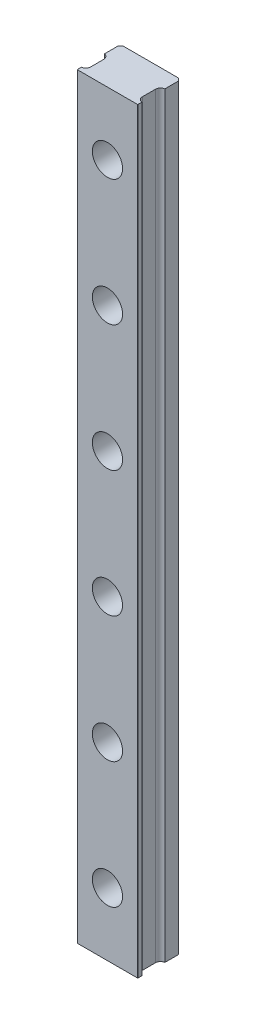
ISO-10303-21;
HEADER;
FILE_DESCRIPTION(('STEP AP214'),'2;1');
FILE_NAME('part.step','',(''),(''),'','','');
FILE_SCHEMA(('AUTOMOTIVE_DESIGN { 1 0 10303 214 1 1 1 1 }'));
ENDSEC;
DATA;
#1=APPLICATION_CONTEXT('core data for automotive mechanical design processes');
#2=APPLICATION_PROTOCOL_DEFINITION('international standard','automotive_design',2000,#1);
#3=PRODUCT_CONTEXT('',#1,'mechanical');
#4=PRODUCT('Part','Part','',(#3));
#5=PRODUCT_RELATED_PRODUCT_CATEGORY('part','',(#4));
#6=PRODUCT_DEFINITION_FORMATION('','',#4);
#7=PRODUCT_DEFINITION_CONTEXT('part definition',#1,'design');
#8=PRODUCT_DEFINITION('design','',#6,#7);
#9=PRODUCT_DEFINITION_SHAPE('','',#8);
#10=(LENGTH_UNIT() NAMED_UNIT(*) SI_UNIT(.MILLI.,.METRE.));
#11=(NAMED_UNIT(*) PLANE_ANGLE_UNIT() SI_UNIT($,.RADIAN.));
#12=(NAMED_UNIT(*) SI_UNIT($,.STERADIAN.) SOLID_ANGLE_UNIT());
#13=UNCERTAINTY_MEASURE_WITH_UNIT(LENGTH_MEASURE(1.E-05),#10,'distance_accuracy_value','');
#14=(GEOMETRIC_REPRESENTATION_CONTEXT(3) GLOBAL_UNCERTAINTY_ASSIGNED_CONTEXT((#13)) GLOBAL_UNIT_ASSIGNED_CONTEXT((#10,
#11,#12)) REPRESENTATION_CONTEXT('',''));
#15=CARTESIAN_POINT('',(0.,0.,0.));
#16=DIRECTION('',(0.,0.,1.));
#17=DIRECTION('',(1.,0.,0.));
#18=AXIS2_PLACEMENT_3D('',#15,#16,#17);
#19=CARTESIAN_POINT('',(6.,150.,8.59999999999999));
#20=DIRECTION('',(1.,0.,0.));
#21=DIRECTION('',(0.,0.,-1.));
#22=AXIS2_PLACEMENT_3D('',#19,#20,#21);
#23=PLANE('',#22);
#24=DIRECTION('',(0.,0.,-1.));
#25=VECTOR('',#24,1.);
#26=CARTESIAN_POINT('',(6.,0.,8.6));
#27=LINE('',#26,#25);
#28=CARTESIAN_POINT('',(6.,0.,3.20784326));
#29=VERTEX_POINT('',#28);
#30=CARTESIAN_POINT('',(6.,0.,0.500000000000028));
#31=VERTEX_POINT('',#30);
#32=EDGE_CURVE('E186',#29,#31,#27,.T.);
#33=ORIENTED_EDGE('',*,*,#32,.T.);
#34=DIRECTION('',(0.,1.,0.));
#35=VECTOR('',#34,1.);
#36=CARTESIAN_POINT('',(6.,150.,0.50000000000002));
#37=LINE('',#36,#35);
#38=CARTESIAN_POINT('',(6.,150.,0.50000000000002));
#39=VERTEX_POINT('',#38);
#40=EDGE_CURVE('E11',#31,#39,#37,.T.);
#41=ORIENTED_EDGE('',*,*,#40,.T.);
#42=DIRECTION('',(0.,0.,-1.));
#43=VECTOR('',#42,1.);
#44=CARTESIAN_POINT('',(6.,150.,8.59999999999999));
#45=LINE('',#44,#43);
#46=CARTESIAN_POINT('',(6.,150.,3.20784325999999));
#47=VERTEX_POINT('',#46);
#48=EDGE_CURVE('E163',#47,#39,#45,.T.);
#49=ORIENTED_EDGE('',*,*,#48,.F.);
#50=DIRECTION('',(0.,-1.,0.));
#51=VECTOR('',#50,1.);
#52=CARTESIAN_POINT('',(6.,150.,3.20784325999999));
#53=LINE('',#52,#51);
#54=EDGE_CURVE('E147',#47,#29,#53,.T.);
#55=ORIENTED_EDGE('',*,*,#54,.T.);
#56=EDGE_LOOP('',(#33,#41,#49,#55));
#57=FACE_BOUND('',#56,.T.);
#58=ADVANCED_FACE('F32',(#57),#23,.T.);
#59=CARTESIAN_POINT('',(-6.,0.,8.6));
#60=DIRECTION('',(-1.,0.,0.));
#61=DIRECTION('',(0.,0.,1.));
#62=AXIS2_PLACEMENT_3D('',#59,#60,#61);
#63=PLANE('',#62);
#64=DIRECTION('',(0.,0.,-1.));
#65=VECTOR('',#64,1.);
#66=CARTESIAN_POINT('',(-6.,0.,8.6));
#67=LINE('',#66,#65);
#68=CARTESIAN_POINT('',(-6.,0.,8.55000000000001));
#69=VERTEX_POINT('',#68);
#70=CARTESIAN_POINT('',(-6.,0.,7.79215674));
#71=VERTEX_POINT('',#70);
#72=EDGE_CURVE('E181',#69,#71,#67,.T.);
#73=ORIENTED_EDGE('',*,*,#72,.F.);
#74=DIRECTION('',(0.,1.,0.));
#75=VECTOR('',#74,1.);
#76=CARTESIAN_POINT('',(-6.,150.,8.55));
#77=LINE('',#76,#75);
#78=CARTESIAN_POINT('',(-6.,150.,8.55));
#79=VERTEX_POINT('',#78);
#80=EDGE_CURVE('E174',#69,#79,#77,.T.);
#81=ORIENTED_EDGE('',*,*,#80,.T.);
#82=DIRECTION('',(0.,0.,-1.));
#83=VECTOR('',#82,1.);
#84=CARTESIAN_POINT('',(-6.,150.,8.59999999999999));
#85=LINE('',#84,#83);
#86=CARTESIAN_POINT('',(-6.,150.,7.79215673999999));
#87=VERTEX_POINT('',#86);
#88=EDGE_CURVE('E172',#79,#87,#85,.T.);
#89=ORIENTED_EDGE('',*,*,#88,.T.);
#90=DIRECTION('',(0.,-1.,0.));
#91=VECTOR('',#90,1.);
#92=CARTESIAN_POINT('',(-6.,150.,7.79215673999999));
#93=LINE('',#92,#91);
#94=EDGE_CURVE('E236',#87,#71,#93,.T.);
#95=ORIENTED_EDGE('',*,*,#94,.T.);
#96=EDGE_LOOP('',(#73,#81,#89,#95));
#97=FACE_BOUND('',#96,.T.);
#98=ADVANCED_FACE('F258',(#97),#63,.T.);
#99=CARTESIAN_POINT('',(6.,150.,8.54999999999998));
#100=VERTEX_POINT('',#99);
#101=CARTESIAN_POINT('',(6.,150.,7.79215673999999));
#102=VERTEX_POINT('',#101);
#103=EDGE_CURVE('E171',#100,#102,#45,.T.);
#104=ORIENTED_EDGE('',*,*,#103,.F.);
#105=DIRECTION('',(0.,-1.,0.));
#106=VECTOR('',#105,1.);
#107=CARTESIAN_POINT('',(6.,0.,8.54999999999999));
#108=LINE('',#107,#106);
#109=CARTESIAN_POINT('',(6.,0.,8.54999999999999));
#110=VERTEX_POINT('',#109);
#111=EDGE_CURVE('E201',#100,#110,#108,.T.);
#112=ORIENTED_EDGE('',*,*,#111,.T.);
#113=CARTESIAN_POINT('',(6.,0.,7.79215674));
#114=VERTEX_POINT('',#113);
#115=EDGE_CURVE('E184',#110,#114,#27,.T.);
#116=ORIENTED_EDGE('',*,*,#115,.T.);
#117=DIRECTION('',(0.,-1.,0.));
#118=VECTOR('',#117,1.);
#119=CARTESIAN_POINT('',(6.,150.,7.79215673999999));
#120=LINE('',#119,#118);
#121=EDGE_CURVE('E156',#102,#114,#120,.T.);
#122=ORIENTED_EDGE('',*,*,#121,.F.);
#123=EDGE_LOOP('',(#104,#112,#116,#122));
#124=FACE_BOUND('',#123,.T.);
#125=ADVANCED_FACE('F260',(#124),#23,.T.);
#126=CARTESIAN_POINT('',(-6.,150.,8.59999999999999));
#127=DIRECTION('',(0.,1.,0.));
#128=DIRECTION('',(0.,0.,1.));
#129=AXIS2_PLACEMENT_3D('',#126,#127,#128);
#130=PLANE('',#129);
#131=DIRECTION('',(1.,0.,0.));
#132=VECTOR('',#131,1.);
#133=CARTESIAN_POINT('',(-6.,150.,0.));
#134=LINE('',#133,#132);
#135=CARTESIAN_POINT('',(-5.50000000000001,150.,0.));
#136=VERTEX_POINT('',#135);
#137=CARTESIAN_POINT('',(5.49999999999996,150.,0.));
#138=VERTEX_POINT('',#137);
#139=EDGE_CURVE('E178',#136,#138,#134,.T.);
#140=ORIENTED_EDGE('',*,*,#139,.F.);
#141=DIRECTION('',(0.707106781186537,0.,-0.707106781186558));
#142=VECTOR('',#141,1.);
#143=CARTESIAN_POINT('',(-10.05,150.,4.55000000000011));
#144=LINE('',#143,#142);
#145=CARTESIAN_POINT('',(-6.,150.,0.499999999999992));
#146=VERTEX_POINT('',#145);
#147=EDGE_CURVE('E212',#136,#146,#144,.F.);
#148=ORIENTED_EDGE('',*,*,#147,.T.);
#149=CARTESIAN_POINT('',(-6.,150.,3.20784325999999));
#150=VERTEX_POINT('',#149);
#151=EDGE_CURVE('E175',#150,#146,#85,.T.);
#152=ORIENTED_EDGE('',*,*,#151,.F.);
#153=CARTESIAN_POINT('',(-6.12500000163629,150.,4.20000000309228));
#154=DIRECTION('',(0.,-1.,0.));
#155=DIRECTION('',(0.,0.,-1.));
#156=AXIS2_PLACEMENT_3D('',#153,#154,#155);
#157=CIRCLE('',#156,1.00000000163629);
#158=CARTESIAN_POINT('',(-5.125,150.,4.20000000309228));
#159=VERTEX_POINT('',#158);
#160=EDGE_CURVE('E304',#150,#159,#157,.T.);
#161=ORIENTED_EDGE('',*,*,#160,.T.);
#162=DIRECTION('',(0.,0.,1.));
#163=VECTOR('',#162,1.);
#164=CARTESIAN_POINT('',(-5.125,150.,4.20000000309228));
#165=LINE('',#164,#163);
#166=CARTESIAN_POINT('',(-5.125,150.,6.8000000012369));
#167=VERTEX_POINT('',#166);
#168=EDGE_CURVE('E240',#159,#167,#165,.T.);
#169=ORIENTED_EDGE('',*,*,#168,.T.);
#170=CARTESIAN_POINT('',(-6.12499999672743,150.,6.80000000123691));
#171=DIRECTION('',(0.,-1.,0.));
#172=DIRECTION('',(0.,0.,-1.));
#173=AXIS2_PLACEMENT_3D('',#170,#171,#172);
#174=CIRCLE('',#173,0.999999996727426);
#175=EDGE_CURVE('E300',#167,#87,#174,.T.);
#176=ORIENTED_EDGE('',*,*,#175,.T.);
#177=ORIENTED_EDGE('',*,*,#88,.F.);
#178=DIRECTION('',(0.707106781186548,0.,0.707106781186548));
#179=VECTOR('',#178,1.);
#180=CARTESIAN_POINT('',(-5.975,150.,8.57499999999999));
#181=LINE('',#180,#179);
#182=CARTESIAN_POINT('',(-5.95000000000001,150.,8.59999999999999));
#183=VERTEX_POINT('',#182);
#184=EDGE_CURVE('E191',#79,#183,#181,.T.);
#185=ORIENTED_EDGE('',*,*,#184,.T.);
#186=DIRECTION('',(1.,0.,0.));
#187=VECTOR('',#186,1.);
#188=CARTESIAN_POINT('',(-6.,150.,8.59999999999999));
#189=LINE('',#188,#187);
#190=CARTESIAN_POINT('',(5.94999999999999,150.,8.59999999999999));
#191=VERTEX_POINT('',#190);
#192=EDGE_CURVE('E247',#183,#191,#189,.T.);
#193=ORIENTED_EDGE('',*,*,#192,.T.);
#194=DIRECTION('',(0.707106781186551,0.,-0.707106781186544));
#195=VECTOR('',#194,1.);
#196=CARTESIAN_POINT('',(-0.0250000000000658,150.,14.575));
#197=LINE('',#196,#195);
#198=EDGE_CURVE('E189',#191,#100,#197,.T.);
#199=ORIENTED_EDGE('',*,*,#198,.T.);
#200=ORIENTED_EDGE('',*,*,#103,.T.);
#201=CARTESIAN_POINT('',(6.12500000163629,150.,6.7999999969077));
#202=DIRECTION('',(0.,-1.,0.));
#203=DIRECTION('',(0.,0.,-1.));
#204=AXIS2_PLACEMENT_3D('',#201,#202,#203);
#205=CIRCLE('',#204,1.00000000163629);
#206=CARTESIAN_POINT('',(5.125,150.,6.7999999969077));
#207=VERTEX_POINT('',#206);
#208=EDGE_CURVE('E167',#102,#207,#205,.T.);
#209=ORIENTED_EDGE('',*,*,#208,.T.);
#210=DIRECTION('',(0.,0.,-1.));
#211=VECTOR('',#210,1.);
#212=CARTESIAN_POINT('',(5.125,150.,6.7999999969077));
#213=LINE('',#212,#211);
#214=CARTESIAN_POINT('',(5.125,150.,4.19999999876307));
#215=VERTEX_POINT('',#214);
#216=EDGE_CURVE('E157',#207,#215,#213,.T.);
#217=ORIENTED_EDGE('',*,*,#216,.T.);
#218=CARTESIAN_POINT('',(6.12499999672743,150.,4.19999999876307));
#219=DIRECTION('',(0.,-1.,0.));
#220=DIRECTION('',(0.,0.,-1.));
#221=AXIS2_PLACEMENT_3D('',#218,#219,#220);
#222=CIRCLE('',#221,0.999999996727429);
#223=EDGE_CURVE('E150',#215,#47,#222,.T.);
#224=ORIENTED_EDGE('',*,*,#223,.T.);
#225=ORIENTED_EDGE('',*,*,#48,.T.);
#226=DIRECTION('',(0.707106781186557,0.,0.707106781186538));
#227=VECTOR('',#226,1.);
#228=CARTESIAN_POINT('',(4.04999999999982,150.,-1.45000000000011));
#229=LINE('',#228,#227);
#230=EDGE_CURVE('E210',#39,#138,#229,.F.);
#231=ORIENTED_EDGE('',*,*,#230,.T.);
#232=EDGE_LOOP('',(#140,#148,#152,#161,#169,#176,#177,#185,#193,#199,#200,#209,#217,#224,#225,#231));
#233=FACE_BOUND('',#232,.T.);
#234=ADVANCED_FACE('F162',(#233),#130,.T.);
#235=ORIENTED_EDGE('',*,*,#151,.T.);
#236=DIRECTION('',(0.,-1.,0.));
#237=VECTOR('',#236,1.);
#238=CARTESIAN_POINT('',(-6.,0.,0.5));
#239=LINE('',#238,#237);
#240=CARTESIAN_POINT('',(-6.,0.,0.5));
#241=VERTEX_POINT('',#240);
#242=EDGE_CURVE('E55',#146,#241,#239,.T.);
#243=ORIENTED_EDGE('',*,*,#242,.T.);
#244=CARTESIAN_POINT('',(-6.,0.,3.20784325999999));
#245=VERTEX_POINT('',#244);
#246=EDGE_CURVE('E183',#245,#241,#67,.T.);
#247=ORIENTED_EDGE('',*,*,#246,.F.);
#248=DIRECTION('',(0.,-1.,0.));
#249=VECTOR('',#248,1.);
#250=CARTESIAN_POINT('',(-6.,150.,3.20784325999999));
#251=LINE('',#250,#249);
#252=EDGE_CURVE('E232',#150,#245,#251,.T.);
#253=ORIENTED_EDGE('',*,*,#252,.F.);
#254=EDGE_LOOP('',(#235,#243,#247,#253));
#255=FACE_BOUND('',#254,.T.);
#256=ADVANCED_FACE('F231',(#255),#63,.T.);
#257=CARTESIAN_POINT('',(6.,0.,8.6));
#258=DIRECTION('',(0.,-1.,0.));
#259=DIRECTION('',(0.,0.,-1.));
#260=AXIS2_PLACEMENT_3D('',#257,#258,#259);
#261=PLANE('',#260);
#262=ORIENTED_EDGE('',*,*,#246,.T.);
#263=DIRECTION('',(-0.707106781186537,0.,0.707106781186558));
#264=VECTOR('',#263,1.);
#265=CARTESIAN_POINT('',(-4.05000000000017,0.,-1.44999999999988));
#266=LINE('',#265,#264);
#267=CARTESIAN_POINT('',(-5.50000000000001,0.,0.));
#268=VERTEX_POINT('',#267);
#269=EDGE_CURVE('E40',#241,#268,#266,.F.);
#270=ORIENTED_EDGE('',*,*,#269,.T.);
#271=DIRECTION('',(-1.,0.,0.));
#272=VECTOR('',#271,1.);
#273=CARTESIAN_POINT('',(6.,0.,0.));
#274=LINE('',#273,#272);
#275=CARTESIAN_POINT('',(5.49999999999996,0.,0.));
#276=VERTEX_POINT('',#275);
#277=EDGE_CURVE('E218',#276,#268,#274,.T.);
#278=ORIENTED_EDGE('',*,*,#277,.F.);
#279=DIRECTION('',(-0.707106781186557,0.,-0.707106781186538));
#280=VECTOR('',#279,1.);
#281=CARTESIAN_POINT('',(10.05,0.,4.5499999999999));
#282=LINE('',#281,#280);
#283=EDGE_CURVE('E47',#276,#31,#282,.F.);
#284=ORIENTED_EDGE('',*,*,#283,.T.);
#285=ORIENTED_EDGE('',*,*,#32,.F.);
#286=CARTESIAN_POINT('',(6.12499999672743,0.,4.19999999876308));
#287=DIRECTION('',(0.,-1.,0.));
#288=DIRECTION('',(0.,0.,-1.));
#289=AXIS2_PLACEMENT_3D('',#286,#287,#288);
#290=CIRCLE('',#289,0.999999996727429);
#291=CARTESIAN_POINT('',(5.125,0.,4.19999999876308));
#292=VERTEX_POINT('',#291);
#293=EDGE_CURVE('E153',#292,#29,#290,.T.);
#294=ORIENTED_EDGE('',*,*,#293,.F.);
#295=DIRECTION('',(0.,0.,-1.));
#296=VECTOR('',#295,1.);
#297=CARTESIAN_POINT('',(5.125,0.,6.79999999690771));
#298=LINE('',#297,#296);
#299=CARTESIAN_POINT('',(5.125,0.,6.79999999690771));
#300=VERTEX_POINT('',#299);
#301=EDGE_CURVE('E168',#300,#292,#298,.T.);
#302=ORIENTED_EDGE('',*,*,#301,.F.);
#303=CARTESIAN_POINT('',(6.12500000163629,0.,6.79999999690771));
#304=DIRECTION('',(0.,-1.,0.));
#305=DIRECTION('',(0.,0.,-1.));
#306=AXIS2_PLACEMENT_3D('',#303,#304,#305);
#307=CIRCLE('',#306,1.00000000163629);
#308=EDGE_CURVE('E708',#114,#300,#307,.T.);
#309=ORIENTED_EDGE('',*,*,#308,.F.);
#310=ORIENTED_EDGE('',*,*,#115,.F.);
#311=DIRECTION('',(-0.707106781186551,0.,0.707106781186544));
#312=VECTOR('',#311,1.);
#313=CARTESIAN_POINT('',(5.975,0.,8.575));
#314=LINE('',#313,#312);
#315=CARTESIAN_POINT('',(5.94999999999999,0.,8.6));
#316=VERTEX_POINT('',#315);
#317=EDGE_CURVE('E197',#110,#316,#314,.T.);
#318=ORIENTED_EDGE('',*,*,#317,.T.);
#319=DIRECTION('',(-1.,0.,0.));
#320=VECTOR('',#319,1.);
#321=CARTESIAN_POINT('',(6.,0.,8.6));
#322=LINE('',#321,#320);
#323=CARTESIAN_POINT('',(-5.95000000000001,0.,8.6));
#324=VERTEX_POINT('',#323);
#325=EDGE_CURVE('E244',#316,#324,#322,.T.);
#326=ORIENTED_EDGE('',*,*,#325,.T.);
#327=DIRECTION('',(-0.707106781186548,0.,-0.707106781186548));
#328=VECTOR('',#327,1.);
#329=CARTESIAN_POINT('',(0.0249999999999964,0.,14.575));
#330=LINE('',#329,#328);
#331=EDGE_CURVE('E199',#324,#69,#330,.T.);
#332=ORIENTED_EDGE('',*,*,#331,.T.);
#333=ORIENTED_EDGE('',*,*,#72,.T.);
#334=CARTESIAN_POINT('',(-6.12499999672743,0.,6.80000000123692));
#335=DIRECTION('',(0.,-1.,0.));
#336=DIRECTION('',(0.,0.,-1.));
#337=AXIS2_PLACEMENT_3D('',#334,#335,#336);
#338=CIRCLE('',#337,0.999999996727426);
#339=CARTESIAN_POINT('',(-5.125,0.,6.80000000123691));
#340=VERTEX_POINT('',#339);
#341=EDGE_CURVE('E302',#340,#71,#338,.T.);
#342=ORIENTED_EDGE('',*,*,#341,.F.);
#343=DIRECTION('',(0.,0.,1.));
#344=VECTOR('',#343,1.);
#345=CARTESIAN_POINT('',(-5.125,0.,4.20000000309229));
#346=LINE('',#345,#344);
#347=CARTESIAN_POINT('',(-5.125,0.,4.20000000309229));
#348=VERTEX_POINT('',#347);
#349=EDGE_CURVE('E305',#348,#340,#346,.T.);
#350=ORIENTED_EDGE('',*,*,#349,.F.);
#351=CARTESIAN_POINT('',(-6.12500000163629,0.,4.20000000309229));
#352=DIRECTION('',(0.,-1.,0.));
#353=DIRECTION('',(0.,0.,-1.));
#354=AXIS2_PLACEMENT_3D('',#351,#352,#353);
#355=CIRCLE('',#354,1.00000000163629);
#356=EDGE_CURVE('E309',#245,#348,#355,.T.);
#357=ORIENTED_EDGE('',*,*,#356,.F.);
#358=EDGE_LOOP('',(#262,#270,#278,#284,#285,#294,#302,#309,#310,#318,#326,#332,#333,#342,#350,#357));
#359=FACE_BOUND('',#358,.T.);
#360=ADVANCED_FACE('F217',(#359),#261,.T.);
#361=CARTESIAN_POINT('',(0.,0.,8.6));
#362=DIRECTION('',(0.,0.,-1.));
#363=DIRECTION('',(-1.,0.,0.));
#364=AXIS2_PLACEMENT_3D('',#361,#362,#363);
#365=PLANE('',#364);
#366=CARTESIAN_POINT('',(0.,137.5,8.6));
#367=DIRECTION('',(0.,0.,1.));
#368=DIRECTION('',(1.,0.,0.));
#369=AXIS2_PLACEMENT_3D('',#366,#367,#368);
#370=CIRCLE('',#369,3.);
#371=CARTESIAN_POINT('',(3.,137.5,8.6));
#372=VERTEX_POINT('',#371);
#373=EDGE_CURVE('E635',#372,#372,#370,.T.);
#374=ORIENTED_EDGE('',*,*,#373,.F.);
#375=EDGE_LOOP('',(#374));
#376=FACE_BOUND('',#375,.T.);
#377=CARTESIAN_POINT('',(0.,112.5,8.6));
#378=DIRECTION('',(0.,0.,1.));
#379=DIRECTION('',(1.,0.,0.));
#380=AXIS2_PLACEMENT_3D('',#377,#378,#379);
#381=CIRCLE('',#380,3.);
#382=CARTESIAN_POINT('',(3.,112.5,8.6));
#383=VERTEX_POINT('',#382);
#384=EDGE_CURVE('E645',#383,#383,#381,.T.);
#385=ORIENTED_EDGE('',*,*,#384,.F.);
#386=EDGE_LOOP('',(#385));
#387=FACE_BOUND('',#386,.T.);
#388=CARTESIAN_POINT('',(0.,87.5,8.6));
#389=DIRECTION('',(0.,0.,1.));
#390=DIRECTION('',(1.,0.,0.));
#391=AXIS2_PLACEMENT_3D('',#388,#389,#390);
#392=CIRCLE('',#391,3.);
#393=CARTESIAN_POINT('',(3.,87.5,8.6));
#394=VERTEX_POINT('',#393);
#395=EDGE_CURVE('E657',#394,#394,#392,.T.);
#396=ORIENTED_EDGE('',*,*,#395,.F.);
#397=EDGE_LOOP('',(#396));
#398=FACE_BOUND('',#397,.T.);
#399=CARTESIAN_POINT('',(0.,62.5,8.6));
#400=DIRECTION('',(0.,0.,1.));
#401=DIRECTION('',(1.,0.,0.));
#402=AXIS2_PLACEMENT_3D('',#399,#400,#401);
#403=CIRCLE('',#402,3.);
#404=CARTESIAN_POINT('',(3.,62.5,8.6));
#405=VERTEX_POINT('',#404);
#406=EDGE_CURVE('E669',#405,#405,#403,.T.);
#407=ORIENTED_EDGE('',*,*,#406,.F.);
#408=EDGE_LOOP('',(#407));
#409=FACE_BOUND('',#408,.T.);
#410=CARTESIAN_POINT('',(0.,37.5,8.6));
#411=DIRECTION('',(0.,0.,1.));
#412=DIRECTION('',(1.,0.,0.));
#413=AXIS2_PLACEMENT_3D('',#410,#411,#412);
#414=CIRCLE('',#413,3.);
#415=CARTESIAN_POINT('',(3.,37.5,8.6));
#416=VERTEX_POINT('',#415);
#417=EDGE_CURVE('E681',#416,#416,#414,.T.);
#418=ORIENTED_EDGE('',*,*,#417,.F.);
#419=EDGE_LOOP('',(#418));
#420=FACE_BOUND('',#419,.T.);
#421=CARTESIAN_POINT('',(0.,12.5,8.6));
#422=DIRECTION('',(0.,0.,1.));
#423=DIRECTION('',(1.,0.,0.));
#424=AXIS2_PLACEMENT_3D('',#421,#422,#423);
#425=CIRCLE('',#424,3.);
#426=CARTESIAN_POINT('',(3.,12.5,8.6));
#427=VERTEX_POINT('',#426);
#428=EDGE_CURVE('E693',#427,#427,#425,.T.);
#429=ORIENTED_EDGE('',*,*,#428,.F.);
#430=EDGE_LOOP('',(#429));
#431=FACE_BOUND('',#430,.T.);
#432=ORIENTED_EDGE('',*,*,#192,.F.);
#433=DIRECTION('',(0.,-1.,0.));
#434=VECTOR('',#433,1.);
#435=CARTESIAN_POINT('',(-5.95000000000001,0.,8.6));
#436=LINE('',#435,#434);
#437=EDGE_CURVE('E195',#183,#324,#436,.T.);
#438=ORIENTED_EDGE('',*,*,#437,.T.);
#439=ORIENTED_EDGE('',*,*,#325,.F.);
#440=DIRECTION('',(0.,1.,0.));
#441=VECTOR('',#440,1.);
#442=CARTESIAN_POINT('',(5.94999999999999,150.,8.59999999999999));
#443=LINE('',#442,#441);
#444=EDGE_CURVE('E193',#316,#191,#443,.T.);
#445=ORIENTED_EDGE('',*,*,#444,.T.);
#446=EDGE_LOOP('',(#432,#438,#439,#445));
#447=FACE_BOUND('',#446,.T.);
#448=ADVANCED_FACE('F286',(#376,#387,#398,#409,#420,#431,#447),#365,.F.);
#449=CARTESIAN_POINT('',(0.,0.,0.));
#450=DIRECTION('',(0.,0.,-1.));
#451=DIRECTION('',(-1.,0.,0.));
#452=AXIS2_PLACEMENT_3D('',#449,#450,#451);
#453=PLANE('',#452);
#454=CARTESIAN_POINT('',(0.,137.5,0.));
#455=DIRECTION('',(0.,0.,1.));
#456=DIRECTION('',(1.,0.,0.));
#457=AXIS2_PLACEMENT_3D('',#454,#455,#456);
#458=CIRCLE('',#457,1.70000000000002);
#459=CARTESIAN_POINT('',(1.70000000000002,137.5,0.));
#460=VERTEX_POINT('',#459);
#461=EDGE_CURVE('E642',#460,#460,#458,.T.);
#462=ORIENTED_EDGE('',*,*,#461,.T.);
#463=EDGE_LOOP('',(#462));
#464=FACE_BOUND('',#463,.T.);
#465=CARTESIAN_POINT('',(0.,112.5,0.));
#466=DIRECTION('',(0.,0.,1.));
#467=DIRECTION('',(1.,0.,0.));
#468=AXIS2_PLACEMENT_3D('',#465,#466,#467);
#469=CIRCLE('',#468,1.70000000000002);
#470=CARTESIAN_POINT('',(1.70000000000002,112.5,0.));
#471=VERTEX_POINT('',#470);
#472=EDGE_CURVE('E654',#471,#471,#469,.T.);
#473=ORIENTED_EDGE('',*,*,#472,.T.);
#474=EDGE_LOOP('',(#473));
#475=FACE_BOUND('',#474,.T.);
#476=CARTESIAN_POINT('',(0.,87.5,0.));
#477=DIRECTION('',(0.,0.,1.));
#478=DIRECTION('',(1.,0.,0.));
#479=AXIS2_PLACEMENT_3D('',#476,#477,#478);
#480=CIRCLE('',#479,1.70000000000002);
#481=CARTESIAN_POINT('',(1.70000000000002,87.5,0.));
#482=VERTEX_POINT('',#481);
#483=EDGE_CURVE('E666',#482,#482,#480,.T.);
#484=ORIENTED_EDGE('',*,*,#483,.T.);
#485=EDGE_LOOP('',(#484));
#486=FACE_BOUND('',#485,.T.);
#487=CARTESIAN_POINT('',(0.,62.5,0.));
#488=DIRECTION('',(0.,0.,1.));
#489=DIRECTION('',(1.,0.,0.));
#490=AXIS2_PLACEMENT_3D('',#487,#488,#489);
#491=CIRCLE('',#490,1.70000000000002);
#492=CARTESIAN_POINT('',(1.70000000000002,62.5,0.));
#493=VERTEX_POINT('',#492);
#494=EDGE_CURVE('E678',#493,#493,#491,.T.);
#495=ORIENTED_EDGE('',*,*,#494,.T.);
#496=EDGE_LOOP('',(#495));
#497=FACE_BOUND('',#496,.T.);
#498=CARTESIAN_POINT('',(0.,37.5,0.));
#499=DIRECTION('',(0.,0.,1.));
#500=DIRECTION('',(1.,0.,0.));
#501=AXIS2_PLACEMENT_3D('',#498,#499,#500);
#502=CIRCLE('',#501,1.70000000000002);
#503=CARTESIAN_POINT('',(1.70000000000002,37.5,0.));
#504=VERTEX_POINT('',#503);
#505=EDGE_CURVE('E690',#504,#504,#502,.T.);
#506=ORIENTED_EDGE('',*,*,#505,.T.);
#507=EDGE_LOOP('',(#506));
#508=FACE_BOUND('',#507,.T.);
#509=CARTESIAN_POINT('',(0.,12.5,0.));
#510=DIRECTION('',(0.,0.,1.));
#511=DIRECTION('',(1.,0.,0.));
#512=AXIS2_PLACEMENT_3D('',#509,#510,#511);
#513=CIRCLE('',#512,1.70000000000002);
#514=CARTESIAN_POINT('',(1.70000000000002,12.5,0.));
#515=VERTEX_POINT('',#514);
#516=EDGE_CURVE('E702',#515,#515,#513,.T.);
#517=ORIENTED_EDGE('',*,*,#516,.T.);
#518=EDGE_LOOP('',(#517));
#519=FACE_BOUND('',#518,.T.);
#520=ORIENTED_EDGE('',*,*,#277,.T.);
#521=DIRECTION('',(0.,1.,0.));
#522=VECTOR('',#521,1.);
#523=CARTESIAN_POINT('',(-5.50000000000001,0.,0.));
#524=LINE('',#523,#522);
#525=EDGE_CURVE('E207',#268,#136,#524,.T.);
#526=ORIENTED_EDGE('',*,*,#525,.T.);
#527=ORIENTED_EDGE('',*,*,#139,.T.);
#528=DIRECTION('',(0.,-1.,0.));
#529=VECTOR('',#528,1.);
#530=CARTESIAN_POINT('',(5.49999999999996,0.,0.));
#531=LINE('',#530,#529);
#532=EDGE_CURVE('E204',#138,#276,#531,.T.);
#533=ORIENTED_EDGE('',*,*,#532,.T.);
#534=EDGE_LOOP('',(#520,#526,#527,#533));
#535=FACE_BOUND('',#534,.T.);
#536=ADVANCED_FACE('F223',(#464,#475,#486,#497,#508,#519,#535),#453,.T.);
#537=CARTESIAN_POINT('',(-6.12499999672743,150.,6.80000000123691));
#538=DIRECTION('',(0.,-1.,0.));
#539=DIRECTION('',(0.,0.,-1.));
#540=AXIS2_PLACEMENT_3D('',#537,#538,#539);
#541=CYLINDRICAL_SURFACE('',#540,0.999999996727426);
#542=ORIENTED_EDGE('',*,*,#341,.T.);
#543=ORIENTED_EDGE('',*,*,#94,.F.);
#544=ORIENTED_EDGE('',*,*,#175,.F.);
#545=DIRECTION('',(0.,-1.,0.));
#546=VECTOR('',#545,1.);
#547=CARTESIAN_POINT('',(-5.125,150.,6.8000000012369));
#548=LINE('',#547,#546);
#549=EDGE_CURVE('E226',#167,#340,#548,.T.);
#550=ORIENTED_EDGE('',*,*,#549,.T.);
#551=EDGE_LOOP('',(#542,#543,#544,#550));
#552=FACE_BOUND('',#551,.T.);
#553=ADVANCED_FACE('F299',(#552),#541,.F.);
#554=CARTESIAN_POINT('',(-5.125,150.,4.20000000309228));
#555=DIRECTION('',(1.,0.,0.));
#556=DIRECTION('',(0.,1.,0.));
#557=AXIS2_PLACEMENT_3D('',#554,#555,#556);
#558=PLANE('',#557);
#559=ORIENTED_EDGE('',*,*,#349,.T.);
#560=ORIENTED_EDGE('',*,*,#549,.F.);
#561=ORIENTED_EDGE('',*,*,#168,.F.);
#562=DIRECTION('',(0.,-1.,0.));
#563=VECTOR('',#562,1.);
#564=CARTESIAN_POINT('',(-5.125,150.,4.20000000309228));
#565=LINE('',#564,#563);
#566=EDGE_CURVE('E235',#159,#348,#565,.T.);
#567=ORIENTED_EDGE('',*,*,#566,.T.);
#568=EDGE_LOOP('',(#559,#560,#561,#567));
#569=FACE_BOUND('',#568,.T.);
#570=ADVANCED_FACE('F318',(#569),#558,.F.);
#571=CARTESIAN_POINT('',(-6.12500000163629,150.,4.20000000309228));
#572=DIRECTION('',(0.,-1.,0.));
#573=DIRECTION('',(0.,0.,-1.));
#574=AXIS2_PLACEMENT_3D('',#571,#572,#573);
#575=CYLINDRICAL_SURFACE('',#574,1.00000000163629);
#576=ORIENTED_EDGE('',*,*,#356,.T.);
#577=ORIENTED_EDGE('',*,*,#566,.F.);
#578=ORIENTED_EDGE('',*,*,#160,.F.);
#579=ORIENTED_EDGE('',*,*,#252,.T.);
#580=EDGE_LOOP('',(#576,#577,#578,#579));
#581=FACE_BOUND('',#580,.T.);
#582=ADVANCED_FACE('F319',(#581),#575,.F.);
#583=CARTESIAN_POINT('',(6.12499999672743,150.,4.19999999876307));
#584=DIRECTION('',(0.,-1.,0.));
#585=DIRECTION('',(0.,0.,-1.));
#586=AXIS2_PLACEMENT_3D('',#583,#584,#585);
#587=CYLINDRICAL_SURFACE('',#586,0.999999996727429);
#588=ORIENTED_EDGE('',*,*,#293,.T.);
#589=ORIENTED_EDGE('',*,*,#54,.F.);
#590=ORIENTED_EDGE('',*,*,#223,.F.);
#591=DIRECTION('',(0.,-1.,0.));
#592=VECTOR('',#591,1.);
#593=CARTESIAN_POINT('',(5.125,150.,4.19999999876307));
#594=LINE('',#593,#592);
#595=EDGE_CURVE('E315',#215,#292,#594,.T.);
#596=ORIENTED_EDGE('',*,*,#595,.T.);
#597=EDGE_LOOP('',(#588,#589,#590,#596));
#598=FACE_BOUND('',#597,.T.);
#599=ADVANCED_FACE('F149',(#598),#587,.F.);
#600=CARTESIAN_POINT('',(5.125,150.,6.7999999969077));
#601=DIRECTION('',(-1.,0.,0.));
#602=DIRECTION('',(0.,-1.,0.));
#603=AXIS2_PLACEMENT_3D('',#600,#601,#602);
#604=PLANE('',#603);
#605=ORIENTED_EDGE('',*,*,#301,.T.);
#606=ORIENTED_EDGE('',*,*,#595,.F.);
#607=ORIENTED_EDGE('',*,*,#216,.F.);
#608=DIRECTION('',(0.,-1.,0.));
#609=VECTOR('',#608,1.);
#610=CARTESIAN_POINT('',(5.125,150.,6.7999999969077));
#611=LINE('',#610,#609);
#612=EDGE_CURVE('E714',#207,#300,#611,.T.);
#613=ORIENTED_EDGE('',*,*,#612,.T.);
#614=EDGE_LOOP('',(#605,#606,#607,#613));
#615=FACE_BOUND('',#614,.T.);
#616=ADVANCED_FACE('F326',(#615),#604,.F.);
#617=CARTESIAN_POINT('',(6.12500000163629,150.,6.7999999969077));
#618=DIRECTION('',(0.,-1.,0.));
#619=DIRECTION('',(0.,0.,-1.));
#620=AXIS2_PLACEMENT_3D('',#617,#618,#619);
#621=CYLINDRICAL_SURFACE('',#620,1.00000000163629);
#622=ORIENTED_EDGE('',*,*,#308,.T.);
#623=ORIENTED_EDGE('',*,*,#612,.F.);
#624=ORIENTED_EDGE('',*,*,#208,.F.);
#625=ORIENTED_EDGE('',*,*,#121,.T.);
#626=EDGE_LOOP('',(#622,#623,#624,#625));
#627=FACE_BOUND('',#626,.T.);
#628=ADVANCED_FACE('F381',(#627),#621,.F.);
#629=CARTESIAN_POINT('',(0.,12.5,8.6));
#630=DIRECTION('',(0.,0.,1.));
#631=DIRECTION('',(1.,0.,0.));
#632=AXIS2_PLACEMENT_3D('',#629,#630,#631);
#633=CYLINDRICAL_SURFACE('',#632,1.70000000000002);
#634=ORIENTED_EDGE('',*,*,#516,.F.);
#635=EDGE_LOOP('',(#634));
#636=FACE_BOUND('',#635,.T.);
#637=CARTESIAN_POINT('',(0.,12.5,3.));
#638=DIRECTION('',(0.,0.,1.));
#639=DIRECTION('',(1.,0.,0.));
#640=AXIS2_PLACEMENT_3D('',#637,#638,#639);
#641=CIRCLE('',#640,1.70000000000002);
#642=CARTESIAN_POINT('',(1.70000000000002,12.5,3.));
#643=VERTEX_POINT('',#642);
#644=EDGE_CURVE('E699',#643,#643,#641,.T.);
#645=ORIENTED_EDGE('',*,*,#644,.T.);
#646=EDGE_LOOP('',(#645));
#647=FACE_BOUND('',#646,.T.);
#648=ADVANCED_FACE('F391',(#636,#647),#633,.F.);
#649=CARTESIAN_POINT('',(1.70000000000002,12.5,3.));
#650=DIRECTION('',(0.,0.,-1.));
#651=DIRECTION('',(-1.,0.,0.));
#652=AXIS2_PLACEMENT_3D('',#649,#650,#651);
#653=PLANE('',#652);
#654=ORIENTED_EDGE('',*,*,#644,.F.);
#655=EDGE_LOOP('',(#654));
#656=FACE_BOUND('',#655,.T.);
#657=CARTESIAN_POINT('',(0.,12.5,3.));
#658=DIRECTION('',(0.,0.,1.));
#659=DIRECTION('',(1.,0.,0.));
#660=AXIS2_PLACEMENT_3D('',#657,#658,#659);
#661=CIRCLE('',#660,3.);
#662=CARTESIAN_POINT('',(3.,12.5,3.));
#663=VERTEX_POINT('',#662);
#664=EDGE_CURVE('E696',#663,#663,#661,.T.);
#665=ORIENTED_EDGE('',*,*,#664,.T.);
#666=EDGE_LOOP('',(#665));
#667=FACE_BOUND('',#666,.T.);
#668=ADVANCED_FACE('F401',(#656,#667),#653,.F.);
#669=CARTESIAN_POINT('',(0.,12.5,8.6));
#670=DIRECTION('',(0.,0.,1.));
#671=DIRECTION('',(1.,0.,0.));
#672=AXIS2_PLACEMENT_3D('',#669,#670,#671);
#673=CYLINDRICAL_SURFACE('',#672,3.);
#674=ORIENTED_EDGE('',*,*,#664,.F.);
#675=EDGE_LOOP('',(#674));
#676=FACE_BOUND('',#675,.T.);
#677=ORIENTED_EDGE('',*,*,#428,.T.);
#678=EDGE_LOOP('',(#677));
#679=FACE_BOUND('',#678,.T.);
#680=ADVANCED_FACE('F411',(#676,#679),#673,.F.);
#681=CARTESIAN_POINT('',(0.,37.5,8.6));
#682=DIRECTION('',(0.,0.,1.));
#683=DIRECTION('',(1.,0.,0.));
#684=AXIS2_PLACEMENT_3D('',#681,#682,#683);
#685=CYLINDRICAL_SURFACE('',#684,1.70000000000002);
#686=ORIENTED_EDGE('',*,*,#505,.F.);
#687=EDGE_LOOP('',(#686));
#688=FACE_BOUND('',#687,.T.);
#689=CARTESIAN_POINT('',(0.,37.5,3.));
#690=DIRECTION('',(0.,0.,1.));
#691=DIRECTION('',(1.,0.,0.));
#692=AXIS2_PLACEMENT_3D('',#689,#690,#691);
#693=CIRCLE('',#692,1.70000000000002);
#694=CARTESIAN_POINT('',(1.70000000000002,37.5,3.));
#695=VERTEX_POINT('',#694);
#696=EDGE_CURVE('E687',#695,#695,#693,.T.);
#697=ORIENTED_EDGE('',*,*,#696,.T.);
#698=EDGE_LOOP('',(#697));
#699=FACE_BOUND('',#698,.T.);
#700=ADVANCED_FACE('F421',(#688,#699),#685,.F.);
#701=CARTESIAN_POINT('',(1.70000000000002,37.5,3.));
#702=DIRECTION('',(0.,0.,-1.));
#703=DIRECTION('',(-1.,0.,0.));
#704=AXIS2_PLACEMENT_3D('',#701,#702,#703);
#705=PLANE('',#704);
#706=ORIENTED_EDGE('',*,*,#696,.F.);
#707=EDGE_LOOP('',(#706));
#708=FACE_BOUND('',#707,.T.);
#709=CARTESIAN_POINT('',(0.,37.5,3.));
#710=DIRECTION('',(0.,0.,1.));
#711=DIRECTION('',(1.,0.,0.));
#712=AXIS2_PLACEMENT_3D('',#709,#710,#711);
#713=CIRCLE('',#712,3.);
#714=CARTESIAN_POINT('',(3.,37.5,3.));
#715=VERTEX_POINT('',#714);
#716=EDGE_CURVE('E684',#715,#715,#713,.T.);
#717=ORIENTED_EDGE('',*,*,#716,.T.);
#718=EDGE_LOOP('',(#717));
#719=FACE_BOUND('',#718,.T.);
#720=ADVANCED_FACE('F431',(#708,#719),#705,.F.);
#721=CARTESIAN_POINT('',(0.,37.5,8.6));
#722=DIRECTION('',(0.,0.,1.));
#723=DIRECTION('',(1.,0.,0.));
#724=AXIS2_PLACEMENT_3D('',#721,#722,#723);
#725=CYLINDRICAL_SURFACE('',#724,3.);
#726=ORIENTED_EDGE('',*,*,#716,.F.);
#727=EDGE_LOOP('',(#726));
#728=FACE_BOUND('',#727,.T.);
#729=ORIENTED_EDGE('',*,*,#417,.T.);
#730=EDGE_LOOP('',(#729));
#731=FACE_BOUND('',#730,.T.);
#732=ADVANCED_FACE('F441',(#728,#731),#725,.F.);
#733=CARTESIAN_POINT('',(0.,62.5,8.6));
#734=DIRECTION('',(0.,0.,1.));
#735=DIRECTION('',(1.,0.,0.));
#736=AXIS2_PLACEMENT_3D('',#733,#734,#735);
#737=CYLINDRICAL_SURFACE('',#736,1.70000000000002);
#738=ORIENTED_EDGE('',*,*,#494,.F.);
#739=EDGE_LOOP('',(#738));
#740=FACE_BOUND('',#739,.T.);
#741=CARTESIAN_POINT('',(0.,62.5,3.));
#742=DIRECTION('',(0.,0.,1.));
#743=DIRECTION('',(1.,0.,0.));
#744=AXIS2_PLACEMENT_3D('',#741,#742,#743);
#745=CIRCLE('',#744,1.70000000000002);
#746=CARTESIAN_POINT('',(1.70000000000002,62.5,3.));
#747=VERTEX_POINT('',#746);
#748=EDGE_CURVE('E675',#747,#747,#745,.T.);
#749=ORIENTED_EDGE('',*,*,#748,.T.);
#750=EDGE_LOOP('',(#749));
#751=FACE_BOUND('',#750,.T.);
#752=ADVANCED_FACE('F451',(#740,#751),#737,.F.);
#753=CARTESIAN_POINT('',(1.70000000000002,62.5,3.));
#754=DIRECTION('',(0.,0.,-1.));
#755=DIRECTION('',(-1.,0.,0.));
#756=AXIS2_PLACEMENT_3D('',#753,#754,#755);
#757=PLANE('',#756);
#758=ORIENTED_EDGE('',*,*,#748,.F.);
#759=EDGE_LOOP('',(#758));
#760=FACE_BOUND('',#759,.T.);
#761=CARTESIAN_POINT('',(0.,62.5,3.));
#762=DIRECTION('',(0.,0.,1.));
#763=DIRECTION('',(1.,0.,0.));
#764=AXIS2_PLACEMENT_3D('',#761,#762,#763);
#765=CIRCLE('',#764,3.);
#766=CARTESIAN_POINT('',(3.,62.5,3.));
#767=VERTEX_POINT('',#766);
#768=EDGE_CURVE('E672',#767,#767,#765,.T.);
#769=ORIENTED_EDGE('',*,*,#768,.T.);
#770=EDGE_LOOP('',(#769));
#771=FACE_BOUND('',#770,.T.);
#772=ADVANCED_FACE('F461',(#760,#771),#757,.F.);
#773=CARTESIAN_POINT('',(0.,62.5,8.6));
#774=DIRECTION('',(0.,0.,1.));
#775=DIRECTION('',(1.,0.,0.));
#776=AXIS2_PLACEMENT_3D('',#773,#774,#775);
#777=CYLINDRICAL_SURFACE('',#776,3.);
#778=ORIENTED_EDGE('',*,*,#768,.F.);
#779=EDGE_LOOP('',(#778));
#780=FACE_BOUND('',#779,.T.);
#781=ORIENTED_EDGE('',*,*,#406,.T.);
#782=EDGE_LOOP('',(#781));
#783=FACE_BOUND('',#782,.T.);
#784=ADVANCED_FACE('F471',(#780,#783),#777,.F.);
#785=CARTESIAN_POINT('',(0.,87.5,8.6));
#786=DIRECTION('',(0.,0.,1.));
#787=DIRECTION('',(1.,0.,0.));
#788=AXIS2_PLACEMENT_3D('',#785,#786,#787);
#789=CYLINDRICAL_SURFACE('',#788,1.70000000000002);
#790=ORIENTED_EDGE('',*,*,#483,.F.);
#791=EDGE_LOOP('',(#790));
#792=FACE_BOUND('',#791,.T.);
#793=CARTESIAN_POINT('',(0.,87.5,3.));
#794=DIRECTION('',(0.,0.,1.));
#795=DIRECTION('',(1.,0.,0.));
#796=AXIS2_PLACEMENT_3D('',#793,#794,#795);
#797=CIRCLE('',#796,1.70000000000002);
#798=CARTESIAN_POINT('',(1.70000000000002,87.5,3.));
#799=VERTEX_POINT('',#798);
#800=EDGE_CURVE('E663',#799,#799,#797,.T.);
#801=ORIENTED_EDGE('',*,*,#800,.T.);
#802=EDGE_LOOP('',(#801));
#803=FACE_BOUND('',#802,.T.);
#804=ADVANCED_FACE('F481',(#792,#803),#789,.F.);
#805=CARTESIAN_POINT('',(1.70000000000002,87.5,3.));
#806=DIRECTION('',(0.,0.,-1.));
#807=DIRECTION('',(-1.,0.,0.));
#808=AXIS2_PLACEMENT_3D('',#805,#806,#807);
#809=PLANE('',#808);
#810=ORIENTED_EDGE('',*,*,#800,.F.);
#811=EDGE_LOOP('',(#810));
#812=FACE_BOUND('',#811,.T.);
#813=CARTESIAN_POINT('',(0.,87.5,3.));
#814=DIRECTION('',(0.,0.,1.));
#815=DIRECTION('',(1.,0.,0.));
#816=AXIS2_PLACEMENT_3D('',#813,#814,#815);
#817=CIRCLE('',#816,3.);
#818=CARTESIAN_POINT('',(3.,87.5,3.));
#819=VERTEX_POINT('',#818);
#820=EDGE_CURVE('E660',#819,#819,#817,.T.);
#821=ORIENTED_EDGE('',*,*,#820,.T.);
#822=EDGE_LOOP('',(#821));
#823=FACE_BOUND('',#822,.T.);
#824=ADVANCED_FACE('F491',(#812,#823),#809,.F.);
#825=CARTESIAN_POINT('',(0.,87.5,8.6));
#826=DIRECTION('',(0.,0.,1.));
#827=DIRECTION('',(1.,0.,0.));
#828=AXIS2_PLACEMENT_3D('',#825,#826,#827);
#829=CYLINDRICAL_SURFACE('',#828,3.);
#830=ORIENTED_EDGE('',*,*,#820,.F.);
#831=EDGE_LOOP('',(#830));
#832=FACE_BOUND('',#831,.T.);
#833=ORIENTED_EDGE('',*,*,#395,.T.);
#834=EDGE_LOOP('',(#833));
#835=FACE_BOUND('',#834,.T.);
#836=ADVANCED_FACE('F501',(#832,#835),#829,.F.);
#837=CARTESIAN_POINT('',(0.,112.5,8.6));
#838=DIRECTION('',(0.,0.,1.));
#839=DIRECTION('',(1.,0.,0.));
#840=AXIS2_PLACEMENT_3D('',#837,#838,#839);
#841=CYLINDRICAL_SURFACE('',#840,1.70000000000002);
#842=ORIENTED_EDGE('',*,*,#472,.F.);
#843=EDGE_LOOP('',(#842));
#844=FACE_BOUND('',#843,.T.);
#845=CARTESIAN_POINT('',(0.,112.5,3.));
#846=DIRECTION('',(0.,0.,1.));
#847=DIRECTION('',(1.,0.,0.));
#848=AXIS2_PLACEMENT_3D('',#845,#846,#847);
#849=CIRCLE('',#848,1.70000000000002);
#850=CARTESIAN_POINT('',(1.70000000000002,112.5,3.));
#851=VERTEX_POINT('',#850);
#852=EDGE_CURVE('E651',#851,#851,#849,.T.);
#853=ORIENTED_EDGE('',*,*,#852,.T.);
#854=EDGE_LOOP('',(#853));
#855=FACE_BOUND('',#854,.T.);
#856=ADVANCED_FACE('F511',(#844,#855),#841,.F.);
#857=CARTESIAN_POINT('',(1.70000000000002,112.5,3.));
#858=DIRECTION('',(0.,0.,-1.));
#859=DIRECTION('',(-1.,0.,0.));
#860=AXIS2_PLACEMENT_3D('',#857,#858,#859);
#861=PLANE('',#860);
#862=ORIENTED_EDGE('',*,*,#852,.F.);
#863=EDGE_LOOP('',(#862));
#864=FACE_BOUND('',#863,.T.);
#865=CARTESIAN_POINT('',(0.,112.5,3.));
#866=DIRECTION('',(0.,0.,1.));
#867=DIRECTION('',(1.,0.,0.));
#868=AXIS2_PLACEMENT_3D('',#865,#866,#867);
#869=CIRCLE('',#868,3.);
#870=CARTESIAN_POINT('',(3.,112.5,3.));
#871=VERTEX_POINT('',#870);
#872=EDGE_CURVE('E648',#871,#871,#869,.T.);
#873=ORIENTED_EDGE('',*,*,#872,.T.);
#874=EDGE_LOOP('',(#873));
#875=FACE_BOUND('',#874,.T.);
#876=ADVANCED_FACE('F521',(#864,#875),#861,.F.);
#877=CARTESIAN_POINT('',(0.,112.5,8.6));
#878=DIRECTION('',(0.,0.,1.));
#879=DIRECTION('',(1.,0.,0.));
#880=AXIS2_PLACEMENT_3D('',#877,#878,#879);
#881=CYLINDRICAL_SURFACE('',#880,3.);
#882=ORIENTED_EDGE('',*,*,#872,.F.);
#883=EDGE_LOOP('',(#882));
#884=FACE_BOUND('',#883,.T.);
#885=ORIENTED_EDGE('',*,*,#384,.T.);
#886=EDGE_LOOP('',(#885));
#887=FACE_BOUND('',#886,.T.);
#888=ADVANCED_FACE('F531',(#884,#887),#881,.F.);
#889=CARTESIAN_POINT('',(0.,137.5,8.6));
#890=DIRECTION('',(0.,0.,1.));
#891=DIRECTION('',(1.,0.,0.));
#892=AXIS2_PLACEMENT_3D('',#889,#890,#891);
#893=CYLINDRICAL_SURFACE('',#892,1.70000000000002);
#894=ORIENTED_EDGE('',*,*,#461,.F.);
#895=EDGE_LOOP('',(#894));
#896=FACE_BOUND('',#895,.T.);
#897=CARTESIAN_POINT('',(0.,137.5,3.));
#898=DIRECTION('',(0.,0.,1.));
#899=DIRECTION('',(1.,0.,0.));
#900=AXIS2_PLACEMENT_3D('',#897,#898,#899);
#901=CIRCLE('',#900,1.70000000000002);
#902=CARTESIAN_POINT('',(1.70000000000002,137.5,3.));
#903=VERTEX_POINT('',#902);
#904=EDGE_CURVE('E637',#903,#903,#901,.T.);
#905=ORIENTED_EDGE('',*,*,#904,.T.);
#906=EDGE_LOOP('',(#905));
#907=FACE_BOUND('',#906,.T.);
#908=ADVANCED_FACE('F541',(#896,#907),#893,.F.);
#909=CARTESIAN_POINT('',(1.70000000000002,137.5,3.));
#910=DIRECTION('',(0.,0.,-1.));
#911=DIRECTION('',(-1.,0.,0.));
#912=AXIS2_PLACEMENT_3D('',#909,#910,#911);
#913=PLANE('',#912);
#914=ORIENTED_EDGE('',*,*,#904,.F.);
#915=EDGE_LOOP('',(#914));
#916=FACE_BOUND('',#915,.T.);
#917=CARTESIAN_POINT('',(0.,137.5,3.));
#918=DIRECTION('',(0.,0.,1.));
#919=DIRECTION('',(1.,0.,0.));
#920=AXIS2_PLACEMENT_3D('',#917,#918,#919);
#921=CIRCLE('',#920,3.);
#922=CARTESIAN_POINT('',(3.,137.5,3.));
#923=VERTEX_POINT('',#922);
#924=EDGE_CURVE('E632',#923,#923,#921,.T.);
#925=ORIENTED_EDGE('',*,*,#924,.T.);
#926=EDGE_LOOP('',(#925));
#927=FACE_BOUND('',#926,.T.);
#928=ADVANCED_FACE('F551',(#916,#927),#913,.F.);
#929=CARTESIAN_POINT('',(0.,137.5,8.6));
#930=DIRECTION('',(0.,0.,1.));
#931=DIRECTION('',(1.,0.,0.));
#932=AXIS2_PLACEMENT_3D('',#929,#930,#931);
#933=CYLINDRICAL_SURFACE('',#932,3.);
#934=ORIENTED_EDGE('',*,*,#924,.F.);
#935=EDGE_LOOP('',(#934));
#936=FACE_BOUND('',#935,.T.);
#937=ORIENTED_EDGE('',*,*,#373,.T.);
#938=EDGE_LOOP('',(#937));
#939=FACE_BOUND('',#938,.T.);
#940=ADVANCED_FACE('F561',(#936,#939),#933,.F.);
#941=CARTESIAN_POINT('',(-6.,0.,8.55000000000001));
#942=DIRECTION('',(-0.707106781186548,0.,0.707106781186548));
#943=DIRECTION('',(0.,-1.,0.));
#944=AXIS2_PLACEMENT_3D('',#941,#942,#943);
#945=PLANE('',#944);
#946=ORIENTED_EDGE('',*,*,#331,.F.);
#947=ORIENTED_EDGE('',*,*,#437,.F.);
#948=ORIENTED_EDGE('',*,*,#184,.F.);
#949=ORIENTED_EDGE('',*,*,#80,.F.);
#950=EDGE_LOOP('',(#946,#947,#948,#949));
#951=FACE_BOUND('',#950,.T.);
#952=ADVANCED_FACE('F289',(#951),#945,.T.);
#953=CARTESIAN_POINT('',(6.,150.,8.54999999999998));
#954=DIRECTION('',(0.707106781186544,0.,0.707106781186551));
#955=DIRECTION('',(0.,1.,0.));
#956=AXIS2_PLACEMENT_3D('',#953,#954,#955);
#957=PLANE('',#956);
#958=ORIENTED_EDGE('',*,*,#198,.F.);
#959=ORIENTED_EDGE('',*,*,#444,.F.);
#960=ORIENTED_EDGE('',*,*,#317,.F.);
#961=ORIENTED_EDGE('',*,*,#111,.F.);
#962=EDGE_LOOP('',(#958,#959,#960,#961));
#963=FACE_BOUND('',#962,.T.);
#964=ADVANCED_FACE('F256',(#963),#957,.T.);
#965=CARTESIAN_POINT('',(-5.50000000000001,0.,0.));
#966=DIRECTION('',(0.707106781186558,0.,0.707106781186537));
#967=DIRECTION('',(0.,1.,0.));
#968=AXIS2_PLACEMENT_3D('',#965,#966,#967);
#969=PLANE('',#968);
#970=ORIENTED_EDGE('',*,*,#269,.F.);
#971=ORIENTED_EDGE('',*,*,#242,.F.);
#972=ORIENTED_EDGE('',*,*,#147,.F.);
#973=ORIENTED_EDGE('',*,*,#525,.F.);
#974=EDGE_LOOP('',(#970,#971,#972,#973));
#975=FACE_BOUND('',#974,.T.);
#976=ADVANCED_FACE('F227',(#975),#969,.F.);
#977=CARTESIAN_POINT('',(5.49999999999996,0.,0.));
#978=DIRECTION('',(-0.707106781186538,0.,0.707106781186557));
#979=DIRECTION('',(0.,-1.,0.));
#980=AXIS2_PLACEMENT_3D('',#977,#978,#979);
#981=PLANE('',#980);
#982=ORIENTED_EDGE('',*,*,#230,.F.);
#983=ORIENTED_EDGE('',*,*,#40,.F.);
#984=ORIENTED_EDGE('',*,*,#283,.F.);
#985=ORIENTED_EDGE('',*,*,#532,.F.);
#986=EDGE_LOOP('',(#982,#983,#984,#985));
#987=FACE_BOUND('',#986,.T.);
#988=ADVANCED_FACE('F34',(#987),#981,.F.);
#989=CLOSED_SHELL('',(#58,#98,#125,#234,#256,#360,#448,#536,#553,#570,#582,#599,#616,#628,#648,
#668,#680,#700,#720,#732,#752,#772,#784,#804,#824,#836,#856,#876,#888,#908,#928,#940,#952,#964,
#976,#988));
#990=MANIFOLD_SOLID_BREP('B2',#989);
#991=ADVANCED_BREP_SHAPE_REPRESENTATION('',(#18,#990),#14);
#992=SHAPE_DEFINITION_REPRESENTATION(#9,#991);
ENDSEC;
END-ISO-10303-21;
